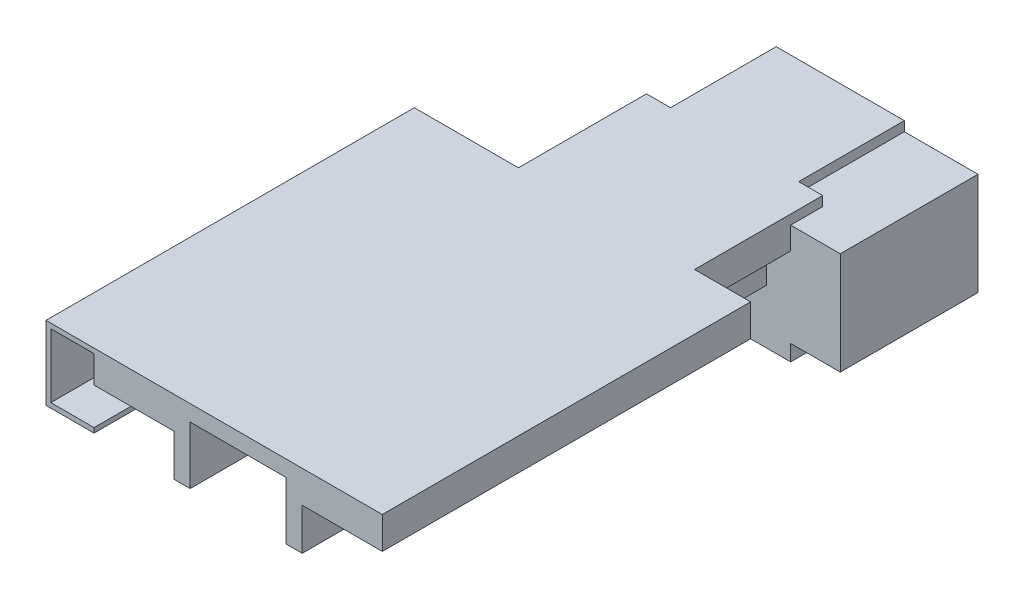
ISO-10303-21;
HEADER;
FILE_DESCRIPTION(('STEP AP214'),'2;1');
FILE_NAME('part.step','',(''),(''),'','','');
FILE_SCHEMA(('AUTOMOTIVE_DESIGN { 1 0 10303 214 1 1 1 1 }'));
ENDSEC;
DATA;
#1=APPLICATION_CONTEXT('core data for automotive mechanical design processes');
#2=APPLICATION_PROTOCOL_DEFINITION('international standard','automotive_design',2000,#1);
#3=PRODUCT_CONTEXT('',#1,'mechanical');
#4=PRODUCT('Part','Part','',(#3));
#5=PRODUCT_RELATED_PRODUCT_CATEGORY('part','',(#4));
#6=PRODUCT_DEFINITION_FORMATION('','',#4);
#7=PRODUCT_DEFINITION_CONTEXT('part definition',#1,'design');
#8=PRODUCT_DEFINITION('design','',#6,#7);
#9=PRODUCT_DEFINITION_SHAPE('','',#8);
#10=(LENGTH_UNIT() NAMED_UNIT(*) SI_UNIT(.MILLI.,.METRE.));
#11=(NAMED_UNIT(*) PLANE_ANGLE_UNIT() SI_UNIT($,.RADIAN.));
#12=(NAMED_UNIT(*) SI_UNIT($,.STERADIAN.) SOLID_ANGLE_UNIT());
#13=UNCERTAINTY_MEASURE_WITH_UNIT(LENGTH_MEASURE(1.E-05),#10,'distance_accuracy_value','');
#14=(GEOMETRIC_REPRESENTATION_CONTEXT(3) GLOBAL_UNCERTAINTY_ASSIGNED_CONTEXT((#13)) GLOBAL_UNIT_ASSIGNED_CONTEXT((#10,
#11,#12)) REPRESENTATION_CONTEXT('',''));
#15=CARTESIAN_POINT('',(0.,0.,0.));
#16=DIRECTION('',(0.,0.,1.));
#17=DIRECTION('',(1.,0.,0.));
#18=AXIS2_PLACEMENT_3D('',#15,#16,#17);
#19=CARTESIAN_POINT('',(0.,0.,-40.));
#20=DIRECTION('',(0.,0.,-1.));
#21=DIRECTION('',(-1.,0.,0.));
#22=AXIS2_PLACEMENT_3D('',#19,#20,#21);
#23=PLANE('',#22);
#24=DIRECTION('',(0.,-1.,0.));
#25=VECTOR('',#24,1.);
#26=CARTESIAN_POINT('',(72.5,-40.,-40.));
#27=LINE('',#26,#25);
#28=CARTESIAN_POINT('',(72.5,0.,-40.));
#29=VERTEX_POINT('',#28);
#30=CARTESIAN_POINT('',(72.5,-3.,-40.));
#31=VERTEX_POINT('',#30);
#32=EDGE_CURVE('E357',#29,#31,#27,.T.);
#33=ORIENTED_EDGE('',*,*,#32,.T.);
#34=DIRECTION('',(-1.,0.,0.));
#35=VECTOR('',#34,1.);
#36=CARTESIAN_POINT('',(72.5,-3.,-40.));
#37=LINE('',#36,#35);
#38=CARTESIAN_POINT('',(65.,-3.,-40.));
#39=VERTEX_POINT('',#38);
#40=EDGE_CURVE('E299',#31,#39,#37,.T.);
#41=ORIENTED_EDGE('',*,*,#40,.T.);
#42=DIRECTION('',(0.,-1.,0.));
#43=VECTOR('',#42,1.);
#44=CARTESIAN_POINT('',(65.,-40.,-40.));
#45=LINE('',#44,#43);
#46=CARTESIAN_POINT('',(65.,0.,-40.));
#47=VERTEX_POINT('',#46);
#48=EDGE_CURVE('E339',#47,#39,#45,.T.);
#49=ORIENTED_EDGE('',*,*,#48,.F.);
#50=DIRECTION('',(1.,0.,0.));
#51=VECTOR('',#50,1.);
#52=CARTESIAN_POINT('',(17.5,0.,-40.));
#53=LINE('',#52,#51);
#54=EDGE_CURVE('E368',#47,#29,#53,.T.);
#55=ORIENTED_EDGE('',*,*,#54,.T.);
#56=EDGE_LOOP('',(#33,#41,#49,#55));
#57=FACE_BOUND('',#56,.T.);
#58=ADVANCED_FACE('F33',(#57),#23,.T.);
#59=CARTESIAN_POINT('',(72.5,0.,-30.));
#60=DIRECTION('',(-1.,0.,0.));
#61=DIRECTION('',(0.,0.,1.));
#62=AXIS2_PLACEMENT_3D('',#59,#60,#61);
#63=PLANE('',#62);
#64=DIRECTION('',(0.,0.,1.));
#65=VECTOR('',#64,1.);
#66=CARTESIAN_POINT('',(72.5,-10.,-30.));
#67=LINE('',#66,#65);
#68=CARTESIAN_POINT('',(72.5,-10.,-30.));
#69=VERTEX_POINT('',#68);
#70=CARTESIAN_POINT('',(72.5,-10.,0.));
#71=VERTEX_POINT('',#70);
#72=EDGE_CURVE('E412',#69,#71,#67,.T.);
#73=ORIENTED_EDGE('',*,*,#72,.F.);
#74=DIRECTION('',(0.,-1.,0.));
#75=VECTOR('',#74,1.);
#76=CARTESIAN_POINT('',(72.5,-3.,-30.));
#77=LINE('',#76,#75);
#78=CARTESIAN_POINT('',(72.5,-3.,-30.));
#79=VERTEX_POINT('',#78);
#80=EDGE_CURVE('E325',#79,#69,#77,.T.);
#81=ORIENTED_EDGE('',*,*,#80,.F.);
#82=DIRECTION('',(0.,0.,-1.));
#83=VECTOR('',#82,1.);
#84=CARTESIAN_POINT('',(72.5,-3.,-40.));
#85=LINE('',#84,#83);
#86=EDGE_CURVE('E296',#79,#31,#85,.T.);
#87=ORIENTED_EDGE('',*,*,#86,.T.);
#88=ORIENTED_EDGE('',*,*,#32,.F.);
#89=DIRECTION('',(0.,0.,1.));
#90=VECTOR('',#89,1.);
#91=CARTESIAN_POINT('',(72.5,0.,-30.));
#92=LINE('',#91,#90);
#93=CARTESIAN_POINT('',(72.5,0.,0.));
#94=VERTEX_POINT('',#93);
#95=EDGE_CURVE('E418',#29,#94,#92,.T.);
#96=ORIENTED_EDGE('',*,*,#95,.T.);
#97=DIRECTION('',(0.,-1.,0.));
#98=VECTOR('',#97,1.);
#99=CARTESIAN_POINT('',(72.5,0.,0.));
#100=LINE('',#99,#98);
#101=EDGE_CURVE('E388',#94,#71,#100,.T.);
#102=ORIENTED_EDGE('',*,*,#101,.T.);
#103=EDGE_LOOP('',(#73,#81,#87,#88,#96,#102));
#104=FACE_BOUND('',#103,.T.);
#105=ADVANCED_FACE('F537',(#104),#63,.F.);
#106=CARTESIAN_POINT('',(65.,-40.,-73.));
#107=DIRECTION('',(-1.,0.,0.));
#108=DIRECTION('',(0.,0.,1.));
#109=AXIS2_PLACEMENT_3D('',#106,#107,#108);
#110=PLANE('',#109);
#111=DIRECTION('',(0.,0.,-1.));
#112=VECTOR('',#111,1.);
#113=CARTESIAN_POINT('',(65.,-3.,-73.));
#114=LINE('',#113,#112);
#115=CARTESIAN_POINT('',(65.,-3.,-73.));
#116=VERTEX_POINT('',#115);
#117=EDGE_CURVE('E302',#39,#116,#114,.T.);
#118=ORIENTED_EDGE('',*,*,#117,.T.);
#119=DIRECTION('',(0.,-1.,0.));
#120=VECTOR('',#119,1.);
#121=CARTESIAN_POINT('',(65.,-40.,-73.));
#122=LINE('',#121,#120);
#123=CARTESIAN_POINT('',(65.,0.,-73.));
#124=VERTEX_POINT('',#123);
#125=EDGE_CURVE('E328',#124,#116,#122,.T.);
#126=ORIENTED_EDGE('',*,*,#125,.F.);
#127=DIRECTION('',(0.,0.,1.));
#128=VECTOR('',#127,1.);
#129=CARTESIAN_POINT('',(65.,0.,-73.));
#130=LINE('',#129,#128);
#131=EDGE_CURVE('E338',#124,#47,#130,.T.);
#132=ORIENTED_EDGE('',*,*,#131,.T.);
#133=ORIENTED_EDGE('',*,*,#48,.T.);
#134=EDGE_LOOP('',(#118,#126,#132,#133));
#135=FACE_BOUND('',#134,.T.);
#136=ADVANCED_FACE('F585',(#135),#110,.F.);
#137=DIRECTION('',(-1.,0.,0.));
#138=VECTOR('',#137,1.);
#139=CARTESIAN_POINT('',(72.5,-35.,-40.));
#140=LINE('',#139,#138);
#141=CARTESIAN_POINT('',(72.5,-35.,-40.));
#142=VERTEX_POINT('',#141);
#143=CARTESIAN_POINT('',(65.,-35.,-40.));
#144=VERTEX_POINT('',#143);
#145=EDGE_CURVE('E317',#142,#144,#140,.T.);
#146=ORIENTED_EDGE('',*,*,#145,.F.);
#147=CARTESIAN_POINT('',(72.5,-40.,-40.));
#148=VERTEX_POINT('',#147);
#149=EDGE_CURVE('E361',#142,#148,#27,.T.);
#150=ORIENTED_EDGE('',*,*,#149,.T.);
#151=DIRECTION('',(-1.,0.,0.));
#152=VECTOR('',#151,1.);
#153=CARTESIAN_POINT('',(17.5,-40.,-40.));
#154=LINE('',#153,#152);
#155=CARTESIAN_POINT('',(65.,-40.,-40.));
#156=VERTEX_POINT('',#155);
#157=EDGE_CURVE('E362',#148,#156,#154,.T.);
#158=ORIENTED_EDGE('',*,*,#157,.T.);
#159=EDGE_CURVE('E324',#144,#156,#45,.T.);
#160=ORIENTED_EDGE('',*,*,#159,.F.);
#161=EDGE_LOOP('',(#146,#150,#158,#160));
#162=FACE_BOUND('',#161,.T.);
#163=ADVANCED_FACE('F521',(#162),#23,.T.);
#164=CARTESIAN_POINT('',(0.,0.,0.));
#165=DIRECTION('',(0.,0.,-1.));
#166=DIRECTION('',(-1.,0.,0.));
#167=AXIS2_PLACEMENT_3D('',#164,#165,#166);
#168=PLANE('',#167);
#169=ORIENTED_EDGE('',*,*,#101,.F.);
#170=DIRECTION('',(-1.,0.,0.));
#171=VECTOR('',#170,1.);
#172=CARTESIAN_POINT('',(0.,0.,0.));
#173=LINE('',#172,#171);
#174=CARTESIAN_POINT('',(90.,0.,0.));
#175=VERTEX_POINT('',#174);
#176=EDGE_CURVE('E267',#175,#94,#173,.T.);
#177=ORIENTED_EDGE('',*,*,#176,.F.);
#178=DIRECTION('',(0.,1.,0.));
#179=VECTOR('',#178,1.);
#180=CARTESIAN_POINT('',(90.,0.,0.));
#181=LINE('',#180,#179);
#182=CARTESIAN_POINT('',(90.,-10.,0.));
#183=VERTEX_POINT('',#182);
#184=EDGE_CURVE('E268',#183,#175,#181,.T.);
#185=ORIENTED_EDGE('',*,*,#184,.F.);
#186=DIRECTION('',(1.,0.,0.));
#187=VECTOR('',#186,1.);
#188=CARTESIAN_POINT('',(90.,-10.,0.));
#189=LINE('',#188,#187);
#190=EDGE_CURVE('E454',#71,#183,#189,.T.);
#191=ORIENTED_EDGE('',*,*,#190,.F.);
#192=EDGE_LOOP('',(#169,#177,#185,#191));
#193=FACE_BOUND('',#192,.T.);
#194=ADVANCED_FACE('F590',(#193),#168,.T.);
#195=CARTESIAN_POINT('',(0.,-10.,115.));
#196=DIRECTION('',(1.,0.,0.));
#197=DIRECTION('',(0.,0.,-1.));
#198=AXIS2_PLACEMENT_3D('',#195,#196,#197);
#199=PLANE('',#198);
#200=DIRECTION('',(0.,-1.,0.));
#201=VECTOR('',#200,1.);
#202=CARTESIAN_POINT('',(0.,-10.,115.));
#203=LINE('',#202,#201);
#204=CARTESIAN_POINT('',(0.,-1.5,115.));
#205=VERTEX_POINT('',#204);
#206=CARTESIAN_POINT('',(0.,-10.,115.));
#207=VERTEX_POINT('',#206);
#208=EDGE_CURVE('E48',#205,#207,#203,.T.);
#209=ORIENTED_EDGE('',*,*,#208,.F.);
#210=DIRECTION('',(0.,0.,1.));
#211=VECTOR('',#210,1.);
#212=CARTESIAN_POINT('',(0.,-1.5,-27.459060435492));
#213=LINE('',#212,#211);
#214=CARTESIAN_POINT('',(0.,-1.5,0.));
#215=VERTEX_POINT('',#214);
#216=EDGE_CURVE('E313',#215,#205,#213,.T.);
#217=ORIENTED_EDGE('',*,*,#216,.F.);
#218=DIRECTION('',(0.,-1.,0.));
#219=VECTOR('',#218,1.);
#220=CARTESIAN_POINT('',(0.,-10.,0.));
#221=LINE('',#220,#219);
#222=CARTESIAN_POINT('',(0.,-10.,0.));
#223=VERTEX_POINT('',#222);
#224=EDGE_CURVE('E425',#215,#223,#221,.T.);
#225=ORIENTED_EDGE('',*,*,#224,.T.);
#226=DIRECTION('',(0.,0.,-1.));
#227=VECTOR('',#226,1.);
#228=CARTESIAN_POINT('',(0.,-10.,115.));
#229=LINE('',#228,#227);
#230=EDGE_CURVE('E11',#207,#223,#229,.T.);
#231=ORIENTED_EDGE('',*,*,#230,.F.);
#232=EDGE_LOOP('',(#209,#217,#225,#231));
#233=FACE_BOUND('',#232,.T.);
#234=ADVANCED_FACE('F35',(#233),#199,.F.);
#235=CARTESIAN_POINT('',(25.,-9.99999999999999,115.));
#236=DIRECTION('',(0.,1.,0.));
#237=DIRECTION('',(-1.,0.,0.));
#238=AXIS2_PLACEMENT_3D('',#235,#236,#237);
#239=PLANE('',#238);
#240=DIRECTION('',(1.,0.,0.));
#241=VECTOR('',#240,1.);
#242=CARTESIAN_POINT('',(25.,-9.99999999999999,0.));
#243=LINE('',#242,#241);
#244=CARTESIAN_POINT('',(17.5,-9.99999999999999,0.));
#245=VERTEX_POINT('',#244);
#246=EDGE_CURVE('E451',#223,#245,#243,.T.);
#247=ORIENTED_EDGE('',*,*,#246,.T.);
#248=DIRECTION('',(0.,0.,1.));
#249=VECTOR('',#248,1.);
#250=CARTESIAN_POINT('',(17.5,-10.,-30.));
#251=LINE('',#250,#249);
#252=CARTESIAN_POINT('',(17.5,-9.99999999999999,-30.));
#253=VERTEX_POINT('',#252);
#254=EDGE_CURVE('E422',#253,#245,#251,.T.);
#255=ORIENTED_EDGE('',*,*,#254,.F.);
#256=DIRECTION('',(-1.,0.,0.));
#257=VECTOR('',#256,1.);
#258=CARTESIAN_POINT('',(25.,-9.99999999999999,-30.));
#259=LINE('',#258,#257);
#260=CARTESIAN_POINT('',(25.,-9.99999999999999,-30.));
#261=VERTEX_POINT('',#260);
#262=EDGE_CURVE('E409',#261,#253,#259,.T.);
#263=ORIENTED_EDGE('',*,*,#262,.F.);
#264=DIRECTION('',(0.,0.,-1.));
#265=VECTOR('',#264,1.);
#266=CARTESIAN_POINT('',(25.,-9.99999999999999,115.));
#267=LINE('',#266,#265);
#268=CARTESIAN_POINT('',(25.,-9.99999999999999,115.));
#269=VERTEX_POINT('',#268);
#270=EDGE_CURVE('E41',#269,#261,#267,.T.);
#271=ORIENTED_EDGE('',*,*,#270,.F.);
#272=DIRECTION('',(1.,0.,0.));
#273=VECTOR('',#272,1.);
#274=CARTESIAN_POINT('',(25.,-9.99999999999999,115.));
#275=LINE('',#274,#273);
#276=EDGE_CURVE('E427',#207,#269,#275,.T.);
#277=ORIENTED_EDGE('',*,*,#276,.F.);
#278=ORIENTED_EDGE('',*,*,#230,.T.);
#279=EDGE_LOOP('',(#247,#255,#263,#271,#277,#278));
#280=FACE_BOUND('',#279,.T.);
#281=ADVANCED_FACE('F484',(#280),#239,.F.);
#282=CARTESIAN_POINT('',(25.,-23.,115.));
#283=DIRECTION('',(1.,0.,0.));
#284=DIRECTION('',(0.,1.,0.));
#285=AXIS2_PLACEMENT_3D('',#282,#283,#284);
#286=PLANE('',#285);
#287=ORIENTED_EDGE('',*,*,#270,.T.);
#288=DIRECTION('',(0.,1.,0.));
#289=VECTOR('',#288,1.);
#290=CARTESIAN_POINT('',(25.,-23.,-30.));
#291=LINE('',#290,#289);
#292=CARTESIAN_POINT('',(25.,-23.,-30.));
#293=VERTEX_POINT('',#292);
#294=EDGE_CURVE('E406',#293,#261,#291,.T.);
#295=ORIENTED_EDGE('',*,*,#294,.F.);
#296=DIRECTION('',(0.,0.,-1.));
#297=VECTOR('',#296,1.);
#298=CARTESIAN_POINT('',(25.,-23.,115.));
#299=LINE('',#298,#297);
#300=CARTESIAN_POINT('',(25.,-23.,115.));
#301=VERTEX_POINT('',#300);
#302=EDGE_CURVE('E474',#301,#293,#299,.T.);
#303=ORIENTED_EDGE('',*,*,#302,.F.);
#304=DIRECTION('',(0.,-1.,0.));
#305=VECTOR('',#304,1.);
#306=CARTESIAN_POINT('',(25.,-23.,115.));
#307=LINE('',#306,#305);
#308=EDGE_CURVE('E429',#269,#301,#307,.T.);
#309=ORIENTED_EDGE('',*,*,#308,.F.);
#310=EDGE_LOOP('',(#287,#295,#303,#309));
#311=FACE_BOUND('',#310,.T.);
#312=ADVANCED_FACE('F480',(#311),#286,.F.);
#313=CARTESIAN_POINT('',(30.,-23.,115.));
#314=DIRECTION('',(0.,1.,0.));
#315=DIRECTION('',(-1.,0.,0.));
#316=AXIS2_PLACEMENT_3D('',#313,#314,#315);
#317=PLANE('',#316);
#318=ORIENTED_EDGE('',*,*,#302,.T.);
#319=DIRECTION('',(-1.,0.,0.));
#320=VECTOR('',#319,1.);
#321=CARTESIAN_POINT('',(30.,-23.,-30.));
#322=LINE('',#321,#320);
#323=CARTESIAN_POINT('',(30.,-23.,-30.));
#324=VERTEX_POINT('',#323);
#325=EDGE_CURVE('E403',#324,#293,#322,.T.);
#326=ORIENTED_EDGE('',*,*,#325,.F.);
#327=DIRECTION('',(0.,0.,-1.));
#328=VECTOR('',#327,1.);
#329=CARTESIAN_POINT('',(30.,-23.,115.));
#330=LINE('',#329,#328);
#331=CARTESIAN_POINT('',(30.,-23.,115.));
#332=VERTEX_POINT('',#331);
#333=EDGE_CURVE('E472',#332,#324,#330,.T.);
#334=ORIENTED_EDGE('',*,*,#333,.F.);
#335=DIRECTION('',(1.,0.,0.));
#336=VECTOR('',#335,1.);
#337=CARTESIAN_POINT('',(30.,-23.,115.));
#338=LINE('',#337,#336);
#339=EDGE_CURVE('E431',#301,#332,#338,.T.);
#340=ORIENTED_EDGE('',*,*,#339,.F.);
#341=EDGE_LOOP('',(#318,#326,#334,#340));
#342=FACE_BOUND('',#341,.T.);
#343=ADVANCED_FACE('F493',(#342),#317,.F.);
#344=CARTESIAN_POINT('',(30.,-5.,115.));
#345=DIRECTION('',(-1.,0.,0.));
#346=DIRECTION('',(0.,-1.,0.));
#347=AXIS2_PLACEMENT_3D('',#344,#345,#346);
#348=PLANE('',#347);
#349=ORIENTED_EDGE('',*,*,#333,.T.);
#350=DIRECTION('',(0.,-1.,0.));
#351=VECTOR('',#350,1.);
#352=CARTESIAN_POINT('',(30.,-5.,-30.));
#353=LINE('',#352,#351);
#354=CARTESIAN_POINT('',(30.,-5.,-30.));
#355=VERTEX_POINT('',#354);
#356=EDGE_CURVE('E400',#355,#324,#353,.T.);
#357=ORIENTED_EDGE('',*,*,#356,.F.);
#358=DIRECTION('',(0.,0.,-1.));
#359=VECTOR('',#358,1.);
#360=CARTESIAN_POINT('',(30.,-5.,115.));
#361=LINE('',#360,#359);
#362=CARTESIAN_POINT('',(30.,-5.,115.));
#363=VERTEX_POINT('',#362);
#364=EDGE_CURVE('E470',#363,#355,#361,.T.);
#365=ORIENTED_EDGE('',*,*,#364,.F.);
#366=DIRECTION('',(0.,1.,0.));
#367=VECTOR('',#366,1.);
#368=CARTESIAN_POINT('',(30.,-5.,115.));
#369=LINE('',#368,#367);
#370=EDGE_CURVE('E433',#332,#363,#369,.T.);
#371=ORIENTED_EDGE('',*,*,#370,.F.);
#372=EDGE_LOOP('',(#349,#357,#365,#371));
#373=FACE_BOUND('',#372,.T.);
#374=ADVANCED_FACE('F570',(#373),#348,.F.);
#375=CARTESIAN_POINT('',(60.,-5.,115.));
#376=DIRECTION('',(0.,1.,0.));
#377=DIRECTION('',(0.,0.,1.));
#378=AXIS2_PLACEMENT_3D('',#375,#376,#377);
#379=PLANE('',#378);
#380=ORIENTED_EDGE('',*,*,#364,.T.);
#381=DIRECTION('',(-1.,0.,0.));
#382=VECTOR('',#381,1.);
#383=CARTESIAN_POINT('',(60.,-5.,-30.));
#384=LINE('',#383,#382);
#385=CARTESIAN_POINT('',(60.,-5.,-30.));
#386=VERTEX_POINT('',#385);
#387=EDGE_CURVE('E397',#386,#355,#384,.T.);
#388=ORIENTED_EDGE('',*,*,#387,.F.);
#389=DIRECTION('',(0.,0.,-1.));
#390=VECTOR('',#389,1.);
#391=CARTESIAN_POINT('',(60.,-5.,115.));
#392=LINE('',#391,#390);
#393=CARTESIAN_POINT('',(60.,-5.,115.));
#394=VERTEX_POINT('',#393);
#395=EDGE_CURVE('E468',#394,#386,#392,.T.);
#396=ORIENTED_EDGE('',*,*,#395,.F.);
#397=DIRECTION('',(1.,0.,0.));
#398=VECTOR('',#397,1.);
#399=CARTESIAN_POINT('',(60.,-5.,115.));
#400=LINE('',#399,#398);
#401=EDGE_CURVE('E435',#363,#394,#400,.T.);
#402=ORIENTED_EDGE('',*,*,#401,.F.);
#403=EDGE_LOOP('',(#380,#388,#396,#402));
#404=FACE_BOUND('',#403,.T.);
#405=ADVANCED_FACE('F567',(#404),#379,.F.);
#406=CARTESIAN_POINT('',(60.,-23.,115.));
#407=DIRECTION('',(1.,0.,0.));
#408=DIRECTION('',(0.,1.,0.));
#409=AXIS2_PLACEMENT_3D('',#406,#407,#408);
#410=PLANE('',#409);
#411=ORIENTED_EDGE('',*,*,#395,.T.);
#412=DIRECTION('',(0.,1.,0.));
#413=VECTOR('',#412,1.);
#414=CARTESIAN_POINT('',(60.,-23.,-30.));
#415=LINE('',#414,#413);
#416=CARTESIAN_POINT('',(60.,-23.,-30.));
#417=VERTEX_POINT('',#416);
#418=EDGE_CURVE('E394',#417,#386,#415,.T.);
#419=ORIENTED_EDGE('',*,*,#418,.F.);
#420=DIRECTION('',(0.,0.,-1.));
#421=VECTOR('',#420,1.);
#422=CARTESIAN_POINT('',(60.,-23.,115.));
#423=LINE('',#422,#421);
#424=CARTESIAN_POINT('',(60.,-23.,115.));
#425=VERTEX_POINT('',#424);
#426=EDGE_CURVE('E466',#425,#417,#423,.T.);
#427=ORIENTED_EDGE('',*,*,#426,.F.);
#428=DIRECTION('',(0.,-1.,0.));
#429=VECTOR('',#428,1.);
#430=CARTESIAN_POINT('',(60.,-23.,115.));
#431=LINE('',#430,#429);
#432=EDGE_CURVE('E437',#394,#425,#431,.T.);
#433=ORIENTED_EDGE('',*,*,#432,.F.);
#434=EDGE_LOOP('',(#411,#419,#427,#433));
#435=FACE_BOUND('',#434,.T.);
#436=ADVANCED_FACE('F563',(#435),#410,.F.);
#437=CARTESIAN_POINT('',(65.,-23.,115.));
#438=DIRECTION('',(0.,1.,0.));
#439=DIRECTION('',(0.,0.,1.));
#440=AXIS2_PLACEMENT_3D('',#437,#438,#439);
#441=PLANE('',#440);
#442=ORIENTED_EDGE('',*,*,#426,.T.);
#443=DIRECTION('',(-1.,0.,0.));
#444=VECTOR('',#443,1.);
#445=CARTESIAN_POINT('',(65.,-23.,-30.));
#446=LINE('',#445,#444);
#447=CARTESIAN_POINT('',(65.,-23.,-30.));
#448=VERTEX_POINT('',#447);
#449=EDGE_CURVE('E391',#448,#417,#446,.T.);
#450=ORIENTED_EDGE('',*,*,#449,.F.);
#451=DIRECTION('',(0.,0.,-1.));
#452=VECTOR('',#451,1.);
#453=CARTESIAN_POINT('',(65.,-23.,115.));
#454=LINE('',#453,#452);
#455=CARTESIAN_POINT('',(65.,-23.,115.));
#456=VERTEX_POINT('',#455);
#457=EDGE_CURVE('E464',#456,#448,#454,.T.);
#458=ORIENTED_EDGE('',*,*,#457,.F.);
#459=DIRECTION('',(1.,0.,0.));
#460=VECTOR('',#459,1.);
#461=CARTESIAN_POINT('',(65.,-23.,115.));
#462=LINE('',#461,#460);
#463=EDGE_CURVE('E439',#425,#456,#462,.T.);
#464=ORIENTED_EDGE('',*,*,#463,.F.);
#465=EDGE_LOOP('',(#442,#450,#458,#464));
#466=FACE_BOUND('',#465,.T.);
#467=ADVANCED_FACE('F558',(#466),#441,.F.);
#468=CARTESIAN_POINT('',(65.,-10.,115.));
#469=DIRECTION('',(-1.,0.,0.));
#470=DIRECTION('',(0.,0.,1.));
#471=AXIS2_PLACEMENT_3D('',#468,#469,#470);
#472=PLANE('',#471);
#473=ORIENTED_EDGE('',*,*,#457,.T.);
#474=DIRECTION('',(0.,-1.,0.));
#475=VECTOR('',#474,1.);
#476=CARTESIAN_POINT('',(65.,-10.,-30.));
#477=LINE('',#476,#475);
#478=CARTESIAN_POINT('',(65.,-10.,-30.));
#479=VERTEX_POINT('',#478);
#480=EDGE_CURVE('E387',#479,#448,#477,.T.);
#481=ORIENTED_EDGE('',*,*,#480,.F.);
#482=DIRECTION('',(0.,0.,-1.));
#483=VECTOR('',#482,1.);
#484=CARTESIAN_POINT('',(65.,-10.,115.));
#485=LINE('',#484,#483);
#486=CARTESIAN_POINT('',(65.,-10.,115.));
#487=VERTEX_POINT('',#486);
#488=EDGE_CURVE('E462',#487,#479,#485,.T.);
#489=ORIENTED_EDGE('',*,*,#488,.F.);
#490=DIRECTION('',(0.,1.,0.));
#491=VECTOR('',#490,1.);
#492=CARTESIAN_POINT('',(65.,-10.,115.));
#493=LINE('',#492,#491);
#494=EDGE_CURVE('E441',#456,#487,#493,.T.);
#495=ORIENTED_EDGE('',*,*,#494,.F.);
#496=EDGE_LOOP('',(#473,#481,#489,#495));
#497=FACE_BOUND('',#496,.T.);
#498=ADVANCED_FACE('F553',(#497),#472,.F.);
#499=CARTESIAN_POINT('',(90.,-10.,115.));
#500=DIRECTION('',(0.,1.,0.));
#501=DIRECTION('',(0.,0.,1.));
#502=AXIS2_PLACEMENT_3D('',#499,#500,#501);
#503=PLANE('',#502);
#504=ORIENTED_EDGE('',*,*,#488,.T.);
#505=DIRECTION('',(-1.,0.,0.));
#506=VECTOR('',#505,1.);
#507=CARTESIAN_POINT('',(72.5,-10.,-30.));
#508=LINE('',#507,#506);
#509=EDGE_CURVE('E384',#69,#479,#508,.T.);
#510=ORIENTED_EDGE('',*,*,#509,.F.);
#511=ORIENTED_EDGE('',*,*,#72,.T.);
#512=ORIENTED_EDGE('',*,*,#190,.T.);
#513=DIRECTION('',(0.,0.,-1.));
#514=VECTOR('',#513,1.);
#515=CARTESIAN_POINT('',(90.,-10.,115.));
#516=LINE('',#515,#514);
#517=CARTESIAN_POINT('',(90.,-10.,115.));
#518=VERTEX_POINT('',#517);
#519=EDGE_CURVE('E459',#518,#183,#516,.T.);
#520=ORIENTED_EDGE('',*,*,#519,.F.);
#521=DIRECTION('',(1.,0.,0.));
#522=VECTOR('',#521,1.);
#523=CARTESIAN_POINT('',(90.,-10.,115.));
#524=LINE('',#523,#522);
#525=EDGE_CURVE('E443',#487,#518,#524,.T.);
#526=ORIENTED_EDGE('',*,*,#525,.F.);
#527=EDGE_LOOP('',(#504,#510,#511,#512,#520,#526));
#528=FACE_BOUND('',#527,.T.);
#529=ADVANCED_FACE('F546',(#528),#503,.F.);
#530=CARTESIAN_POINT('',(90.,0.,115.));
#531=DIRECTION('',(-1.,0.,0.));
#532=DIRECTION('',(0.,-1.,0.));
#533=AXIS2_PLACEMENT_3D('',#530,#531,#532);
#534=PLANE('',#533);
#535=ORIENTED_EDGE('',*,*,#184,.T.);
#536=DIRECTION('',(0.,0.,-1.));
#537=VECTOR('',#536,1.);
#538=CARTESIAN_POINT('',(90.,0.,115.));
#539=LINE('',#538,#537);
#540=CARTESIAN_POINT('',(90.,0.,115.));
#541=VERTEX_POINT('',#540);
#542=EDGE_CURVE('E449',#541,#175,#539,.T.);
#543=ORIENTED_EDGE('',*,*,#542,.F.);
#544=DIRECTION('',(0.,1.,0.));
#545=VECTOR('',#544,1.);
#546=CARTESIAN_POINT('',(90.,0.,115.));
#547=LINE('',#546,#545);
#548=EDGE_CURVE('E445',#518,#541,#547,.T.);
#549=ORIENTED_EDGE('',*,*,#548,.F.);
#550=ORIENTED_EDGE('',*,*,#519,.T.);
#551=EDGE_LOOP('',(#535,#543,#549,#550));
#552=FACE_BOUND('',#551,.T.);
#553=ADVANCED_FACE('F691',(#552),#534,.F.);
#554=CARTESIAN_POINT('',(0.,0.,115.));
#555=DIRECTION('',(0.,-1.,0.));
#556=DIRECTION('',(0.,0.,-1.));
#557=AXIS2_PLACEMENT_3D('',#554,#555,#556);
#558=PLANE('',#557);
#559=ORIENTED_EDGE('',*,*,#176,.T.);
#560=ORIENTED_EDGE('',*,*,#95,.F.);
#561=ORIENTED_EDGE('',*,*,#54,.F.);
#562=ORIENTED_EDGE('',*,*,#131,.F.);
#563=DIRECTION('',(1.,0.,0.));
#564=VECTOR('',#563,1.);
#565=CARTESIAN_POINT('',(25.,0.,-73.));
#566=LINE('',#565,#564);
#567=CARTESIAN_POINT('',(25.,0.,-73.));
#568=VERTEX_POINT('',#567);
#569=EDGE_CURVE('E336',#568,#124,#566,.T.);
#570=ORIENTED_EDGE('',*,*,#569,.F.);
#571=DIRECTION('',(0.,0.,1.));
#572=VECTOR('',#571,1.);
#573=CARTESIAN_POINT('',(25.,0.,-73.));
#574=LINE('',#573,#572);
#575=CARTESIAN_POINT('',(25.,0.,-40.));
#576=VERTEX_POINT('',#575);
#577=EDGE_CURVE('E347',#568,#576,#574,.T.);
#578=ORIENTED_EDGE('',*,*,#577,.T.);
#579=CARTESIAN_POINT('',(17.5,0.,-40.));
#580=VERTEX_POINT('',#579);
#581=EDGE_CURVE('E369',#580,#576,#53,.T.);
#582=ORIENTED_EDGE('',*,*,#581,.F.);
#583=DIRECTION('',(0.,0.,1.));
#584=VECTOR('',#583,1.);
#585=CARTESIAN_POINT('',(17.5,0.,-30.));
#586=LINE('',#585,#584);
#587=CARTESIAN_POINT('',(17.5,0.,0.));
#588=VERTEX_POINT('',#587);
#589=EDGE_CURVE('E264',#580,#588,#586,.T.);
#590=ORIENTED_EDGE('',*,*,#589,.T.);
#591=CARTESIAN_POINT('',(-15.,0.,0.));
#592=VERTEX_POINT('',#591);
#593=EDGE_CURVE('E255',#588,#592,#173,.T.);
#594=ORIENTED_EDGE('',*,*,#593,.T.);
#595=DIRECTION('',(0.,0.,1.));
#596=VECTOR('',#595,1.);
#597=CARTESIAN_POINT('',(-15.,0.,-27.459060435492));
#598=LINE('',#597,#596);
#599=CARTESIAN_POINT('',(-15.,0.,115.));
#600=VERTEX_POINT('',#599);
#601=EDGE_CURVE('E261',#592,#600,#598,.T.);
#602=ORIENTED_EDGE('',*,*,#601,.T.);
#603=DIRECTION('',(-1.,0.,0.));
#604=VECTOR('',#603,1.);
#605=CARTESIAN_POINT('',(0.,0.,115.));
#606=LINE('',#605,#604);
#607=EDGE_CURVE('E447',#541,#600,#606,.T.);
#608=ORIENTED_EDGE('',*,*,#607,.F.);
#609=ORIENTED_EDGE('',*,*,#542,.T.);
#610=EDGE_LOOP('',(#559,#560,#561,#562,#570,#578,#582,#590,#594,#602,#608,#609));
#611=FACE_BOUND('',#610,.T.);
#612=ADVANCED_FACE('F258',(#611),#558,.F.);
#613=CARTESIAN_POINT('',(0.,0.,115.));
#614=DIRECTION('',(0.,0.,-1.));
#615=DIRECTION('',(-1.,0.,0.));
#616=AXIS2_PLACEMENT_3D('',#613,#614,#615);
#617=PLANE('',#616);
#618=ORIENTED_EDGE('',*,*,#607,.T.);
#619=DIRECTION('',(0.,-1.,0.));
#620=VECTOR('',#619,1.);
#621=CARTESIAN_POINT('',(-15.,0.,115.));
#622=LINE('',#621,#620);
#623=CARTESIAN_POINT('',(-15.,-23.,115.));
#624=VERTEX_POINT('',#623);
#625=EDGE_CURVE('E281',#600,#624,#622,.T.);
#626=ORIENTED_EDGE('',*,*,#625,.T.);
#627=DIRECTION('',(1.,0.,0.));
#628=VECTOR('',#627,1.);
#629=CARTESIAN_POINT('',(-15.,-23.,115.));
#630=LINE('',#629,#628);
#631=CARTESIAN_POINT('',(0.,-23.,115.));
#632=VERTEX_POINT('',#631);
#633=EDGE_CURVE('E676',#624,#632,#630,.T.);
#634=ORIENTED_EDGE('',*,*,#633,.T.);
#635=DIRECTION('',(0.,1.,0.));
#636=VECTOR('',#635,1.);
#637=CARTESIAN_POINT('',(0.,-23.,115.));
#638=LINE('',#637,#636);
#639=CARTESIAN_POINT('',(0.,-21.5,115.));
#640=VERTEX_POINT('',#639);
#641=EDGE_CURVE('E678',#632,#640,#638,.T.);
#642=ORIENTED_EDGE('',*,*,#641,.T.);
#643=DIRECTION('',(-1.,0.,0.));
#644=VECTOR('',#643,1.);
#645=CARTESIAN_POINT('',(0.,-21.5,115.));
#646=LINE('',#645,#644);
#647=CARTESIAN_POINT('',(-13.5,-21.5,115.));
#648=VERTEX_POINT('',#647);
#649=EDGE_CURVE('E682',#640,#648,#646,.T.);
#650=ORIENTED_EDGE('',*,*,#649,.T.);
#651=DIRECTION('',(0.,1.,0.));
#652=VECTOR('',#651,1.);
#653=CARTESIAN_POINT('',(-13.5,-21.5,115.));
#654=LINE('',#653,#652);
#655=CARTESIAN_POINT('',(-13.5,-1.5,115.));
#656=VERTEX_POINT('',#655);
#657=EDGE_CURVE('E285',#648,#656,#654,.T.);
#658=ORIENTED_EDGE('',*,*,#657,.T.);
#659=DIRECTION('',(1.,0.,0.));
#660=VECTOR('',#659,1.);
#661=CARTESIAN_POINT('',(-13.5,-1.5,115.));
#662=LINE('',#661,#660);
#663=EDGE_CURVE('E282',#656,#205,#662,.T.);
#664=ORIENTED_EDGE('',*,*,#663,.T.);
#665=ORIENTED_EDGE('',*,*,#208,.T.);
#666=ORIENTED_EDGE('',*,*,#276,.T.);
#667=ORIENTED_EDGE('',*,*,#308,.T.);
#668=ORIENTED_EDGE('',*,*,#339,.T.);
#669=ORIENTED_EDGE('',*,*,#370,.T.);
#670=ORIENTED_EDGE('',*,*,#401,.T.);
#671=ORIENTED_EDGE('',*,*,#432,.T.);
#672=ORIENTED_EDGE('',*,*,#463,.T.);
#673=ORIENTED_EDGE('',*,*,#494,.T.);
#674=ORIENTED_EDGE('',*,*,#525,.T.);
#675=ORIENTED_EDGE('',*,*,#548,.T.);
#676=EDGE_LOOP('',(#618,#626,#634,#642,#650,#658,#664,#665,#666,#667,#668,#669,#670,#671,#672,
#673,#674,#675));
#677=FACE_BOUND('',#676,.T.);
#678=ADVANCED_FACE('F497',(#677),#617,.F.);
#679=DIRECTION('',(0.,1.,0.));
#680=VECTOR('',#679,1.);
#681=CARTESIAN_POINT('',(17.5,-10.,0.));
#682=LINE('',#681,#680);
#683=EDGE_CURVE('E383',#245,#588,#682,.T.);
#684=ORIENTED_EDGE('',*,*,#683,.F.);
#685=ORIENTED_EDGE('',*,*,#246,.F.);
#686=ORIENTED_EDGE('',*,*,#224,.F.);
#687=DIRECTION('',(1.,0.,0.));
#688=VECTOR('',#687,1.);
#689=CARTESIAN_POINT('',(-13.5,-1.5,0.));
#690=LINE('',#689,#688);
#691=CARTESIAN_POINT('',(-13.5,-1.5,0.));
#692=VERTEX_POINT('',#691);
#693=EDGE_CURVE('E650',#692,#215,#690,.T.);
#694=ORIENTED_EDGE('',*,*,#693,.F.);
#695=DIRECTION('',(0.,1.,0.));
#696=VECTOR('',#695,1.);
#697=CARTESIAN_POINT('',(-13.5,-21.5,0.));
#698=LINE('',#697,#696);
#699=CARTESIAN_POINT('',(-13.5,-21.5,0.));
#700=VERTEX_POINT('',#699);
#701=EDGE_CURVE('E653',#700,#692,#698,.T.);
#702=ORIENTED_EDGE('',*,*,#701,.F.);
#703=DIRECTION('',(-1.,0.,0.));
#704=VECTOR('',#703,1.);
#705=CARTESIAN_POINT('',(0.,-21.5,0.));
#706=LINE('',#705,#704);
#707=CARTESIAN_POINT('',(0.,-21.5,0.));
#708=VERTEX_POINT('',#707);
#709=EDGE_CURVE('E659',#708,#700,#706,.T.);
#710=ORIENTED_EDGE('',*,*,#709,.F.);
#711=DIRECTION('',(0.,1.,0.));
#712=VECTOR('',#711,1.);
#713=CARTESIAN_POINT('',(0.,-23.,0.));
#714=LINE('',#713,#712);
#715=CARTESIAN_POINT('',(0.,-23.,0.));
#716=VERTEX_POINT('',#715);
#717=EDGE_CURVE('E666',#716,#708,#714,.T.);
#718=ORIENTED_EDGE('',*,*,#717,.F.);
#719=DIRECTION('',(1.,0.,0.));
#720=VECTOR('',#719,1.);
#721=CARTESIAN_POINT('',(-15.,-23.,0.));
#722=LINE('',#721,#720);
#723=CARTESIAN_POINT('',(-15.,-23.,0.));
#724=VERTEX_POINT('',#723);
#725=EDGE_CURVE('E274',#724,#716,#722,.T.);
#726=ORIENTED_EDGE('',*,*,#725,.F.);
#727=DIRECTION('',(0.,-1.,0.));
#728=VECTOR('',#727,1.);
#729=CARTESIAN_POINT('',(-15.,0.,0.));
#730=LINE('',#729,#728);
#731=EDGE_CURVE('E271',#592,#724,#730,.T.);
#732=ORIENTED_EDGE('',*,*,#731,.F.);
#733=ORIENTED_EDGE('',*,*,#593,.F.);
#734=EDGE_LOOP('',(#684,#685,#686,#694,#702,#710,#718,#726,#732,#733));
#735=FACE_BOUND('',#734,.T.);
#736=ADVANCED_FACE('F272',(#735),#168,.T.);
#737=CARTESIAN_POINT('',(17.5,-10.,-30.));
#738=DIRECTION('',(1.,0.,0.));
#739=DIRECTION('',(0.,1.,0.));
#740=AXIS2_PLACEMENT_3D('',#737,#738,#739);
#741=PLANE('',#740);
#742=ORIENTED_EDGE('',*,*,#683,.T.);
#743=ORIENTED_EDGE('',*,*,#589,.F.);
#744=DIRECTION('',(0.,1.,0.));
#745=VECTOR('',#744,1.);
#746=CARTESIAN_POINT('',(17.5,-40.,-40.));
#747=LINE('',#746,#745);
#748=CARTESIAN_POINT('',(17.5,-40.,-40.));
#749=VERTEX_POINT('',#748);
#750=EDGE_CURVE('E365',#749,#580,#747,.T.);
#751=ORIENTED_EDGE('',*,*,#750,.F.);
#752=DIRECTION('',(0.,0.,1.));
#753=VECTOR('',#752,1.);
#754=CARTESIAN_POINT('',(17.5,-40.,-40.));
#755=LINE('',#754,#753);
#756=CARTESIAN_POINT('',(17.5,-40.,-30.));
#757=VERTEX_POINT('',#756);
#758=EDGE_CURVE('E371',#749,#757,#755,.T.);
#759=ORIENTED_EDGE('',*,*,#758,.T.);
#760=DIRECTION('',(0.,1.,0.));
#761=VECTOR('',#760,1.);
#762=CARTESIAN_POINT('',(17.5,-40.,-30.));
#763=LINE('',#762,#761);
#764=EDGE_CURVE('E375',#757,#253,#763,.T.);
#765=ORIENTED_EDGE('',*,*,#764,.T.);
#766=ORIENTED_EDGE('',*,*,#254,.T.);
#767=EDGE_LOOP('',(#742,#743,#751,#759,#765,#766));
#768=FACE_BOUND('',#767,.T.);
#769=ADVANCED_FACE('F502',(#768),#741,.F.);
#770=ORIENTED_EDGE('',*,*,#149,.F.);
#771=DIRECTION('',(0.,0.,-1.));
#772=VECTOR('',#771,1.);
#773=CARTESIAN_POINT('',(72.5,-35.,-40.));
#774=LINE('',#773,#772);
#775=CARTESIAN_POINT('',(72.5,-35.,-30.));
#776=VERTEX_POINT('',#775);
#777=EDGE_CURVE('E315',#776,#142,#774,.T.);
#778=ORIENTED_EDGE('',*,*,#777,.F.);
#779=DIRECTION('',(0.,-1.,0.));
#780=VECTOR('',#779,1.);
#781=CARTESIAN_POINT('',(72.5,-40.,-30.));
#782=LINE('',#781,#780);
#783=CARTESIAN_POINT('',(72.5,-40.,-30.));
#784=VERTEX_POINT('',#783);
#785=EDGE_CURVE('E356',#776,#784,#782,.T.);
#786=ORIENTED_EDGE('',*,*,#785,.T.);
#787=DIRECTION('',(0.,0.,1.));
#788=VECTOR('',#787,1.);
#789=CARTESIAN_POINT('',(72.5,-40.,-40.));
#790=LINE('',#789,#788);
#791=EDGE_CURVE('E380',#148,#784,#790,.T.);
#792=ORIENTED_EDGE('',*,*,#791,.F.);
#793=EDGE_LOOP('',(#770,#778,#786,#792));
#794=FACE_BOUND('',#793,.T.);
#795=ADVANCED_FACE('F513',(#794),#63,.F.);
#796=CARTESIAN_POINT('',(0.,0.,-30.));
#797=DIRECTION('',(0.,0.,-1.));
#798=DIRECTION('',(-1.,0.,0.));
#799=AXIS2_PLACEMENT_3D('',#796,#797,#798);
#800=PLANE('',#799);
#801=ORIENTED_EDGE('',*,*,#785,.F.);
#802=DIRECTION('',(-1.,0.,0.));
#803=VECTOR('',#802,1.);
#804=CARTESIAN_POINT('',(88.,-35.,-30.));
#805=LINE('',#804,#803);
#806=CARTESIAN_POINT('',(88.,-35.,-30.));
#807=VERTEX_POINT('',#806);
#808=EDGE_CURVE('E312',#807,#776,#805,.T.);
#809=ORIENTED_EDGE('',*,*,#808,.F.);
#810=DIRECTION('',(0.,-1.,0.));
#811=VECTOR('',#810,1.);
#812=CARTESIAN_POINT('',(88.,-3.00000000000001,-30.));
#813=LINE('',#812,#811);
#814=CARTESIAN_POINT('',(88.,-3.00000000000001,-30.));
#815=VERTEX_POINT('',#814);
#816=EDGE_CURVE('E308',#815,#807,#813,.T.);
#817=ORIENTED_EDGE('',*,*,#816,.F.);
#818=DIRECTION('',(-1.,0.,0.));
#819=VECTOR('',#818,1.);
#820=CARTESIAN_POINT('',(88.,-3.00000000000001,-30.));
#821=LINE('',#820,#819);
#822=EDGE_CURVE('E293',#815,#79,#821,.T.);
#823=ORIENTED_EDGE('',*,*,#822,.T.);
#824=ORIENTED_EDGE('',*,*,#80,.T.);
#825=ORIENTED_EDGE('',*,*,#509,.T.);
#826=ORIENTED_EDGE('',*,*,#480,.T.);
#827=ORIENTED_EDGE('',*,*,#449,.T.);
#828=ORIENTED_EDGE('',*,*,#418,.T.);
#829=ORIENTED_EDGE('',*,*,#387,.T.);
#830=ORIENTED_EDGE('',*,*,#356,.T.);
#831=ORIENTED_EDGE('',*,*,#325,.T.);
#832=ORIENTED_EDGE('',*,*,#294,.T.);
#833=ORIENTED_EDGE('',*,*,#262,.T.);
#834=ORIENTED_EDGE('',*,*,#764,.F.);
#835=DIRECTION('',(-1.,0.,0.));
#836=VECTOR('',#835,1.);
#837=CARTESIAN_POINT('',(17.5,-40.,-30.));
#838=LINE('',#837,#836);
#839=EDGE_CURVE('E373',#784,#757,#838,.T.);
#840=ORIENTED_EDGE('',*,*,#839,.F.);
#841=EDGE_LOOP('',(#801,#809,#817,#823,#824,#825,#826,#827,#828,#829,#830,#831,#832,#833,#834,#840));
#842=FACE_BOUND('',#841,.T.);
#843=ADVANCED_FACE('F488',(#842),#800,.F.);
#844=CARTESIAN_POINT('',(17.5,-40.,-40.));
#845=DIRECTION('',(0.,1.,0.));
#846=DIRECTION('',(-1.,0.,0.));
#847=AXIS2_PLACEMENT_3D('',#844,#845,#846);
#848=PLANE('',#847);
#849=ORIENTED_EDGE('',*,*,#839,.T.);
#850=ORIENTED_EDGE('',*,*,#758,.F.);
#851=CARTESIAN_POINT('',(25.,-40.,-40.));
#852=VERTEX_POINT('',#851);
#853=EDGE_CURVE('E360',#852,#749,#154,.T.);
#854=ORIENTED_EDGE('',*,*,#853,.F.);
#855=DIRECTION('',(0.,0.,1.));
#856=VECTOR('',#855,1.);
#857=CARTESIAN_POINT('',(25.,-40.,-73.));
#858=LINE('',#857,#856);
#859=CARTESIAN_POINT('',(25.,-40.,-73.));
#860=VERTEX_POINT('',#859);
#861=EDGE_CURVE('E350',#860,#852,#858,.T.);
#862=ORIENTED_EDGE('',*,*,#861,.F.);
#863=DIRECTION('',(-1.,0.,0.));
#864=VECTOR('',#863,1.);
#865=CARTESIAN_POINT('',(25.,-40.,-73.));
#866=LINE('',#865,#864);
#867=CARTESIAN_POINT('',(65.,-40.,-73.));
#868=VERTEX_POINT('',#867);
#869=EDGE_CURVE('E331',#868,#860,#866,.T.);
#870=ORIENTED_EDGE('',*,*,#869,.F.);
#871=DIRECTION('',(0.,0.,1.));
#872=VECTOR('',#871,1.);
#873=CARTESIAN_POINT('',(65.,-40.,-73.));
#874=LINE('',#873,#872);
#875=EDGE_CURVE('E353',#868,#156,#874,.T.);
#876=ORIENTED_EDGE('',*,*,#875,.T.);
#877=ORIENTED_EDGE('',*,*,#157,.F.);
#878=ORIENTED_EDGE('',*,*,#791,.T.);
#879=EDGE_LOOP('',(#849,#850,#854,#862,#870,#876,#877,#878));
#880=FACE_BOUND('',#879,.T.);
#881=ADVANCED_FACE('F510',(#880),#848,.F.);
#882=DIRECTION('',(0.,1.,0.));
#883=VECTOR('',#882,1.);
#884=CARTESIAN_POINT('',(25.,-40.,-40.));
#885=LINE('',#884,#883);
#886=EDGE_CURVE('E342',#852,#576,#885,.T.);
#887=ORIENTED_EDGE('',*,*,#886,.F.);
#888=ORIENTED_EDGE('',*,*,#853,.T.);
#889=ORIENTED_EDGE('',*,*,#750,.T.);
#890=ORIENTED_EDGE('',*,*,#581,.T.);
#891=EDGE_LOOP('',(#887,#888,#889,#890));
#892=FACE_BOUND('',#891,.T.);
#893=ADVANCED_FACE('F581',(#892),#23,.T.);
#894=CARTESIAN_POINT('',(65.,-35.,-73.));
#895=VERTEX_POINT('',#894);
#896=EDGE_CURVE('E332',#895,#868,#122,.T.);
#897=ORIENTED_EDGE('',*,*,#896,.F.);
#898=DIRECTION('',(0.,0.,-1.));
#899=VECTOR('',#898,1.);
#900=CARTESIAN_POINT('',(65.,-35.,-73.));
#901=LINE('',#900,#899);
#902=EDGE_CURVE('E319',#144,#895,#901,.T.);
#903=ORIENTED_EDGE('',*,*,#902,.F.);
#904=ORIENTED_EDGE('',*,*,#159,.T.);
#905=ORIENTED_EDGE('',*,*,#875,.F.);
#906=EDGE_LOOP('',(#897,#903,#904,#905));
#907=FACE_BOUND('',#906,.T.);
#908=ADVANCED_FACE('F525',(#907),#110,.F.);
#909=CARTESIAN_POINT('',(25.,-40.,-73.));
#910=DIRECTION('',(1.,0.,0.));
#911=DIRECTION('',(0.,0.,-1.));
#912=AXIS2_PLACEMENT_3D('',#909,#910,#911);
#913=PLANE('',#912);
#914=ORIENTED_EDGE('',*,*,#886,.T.);
#915=ORIENTED_EDGE('',*,*,#577,.F.);
#916=DIRECTION('',(0.,1.,0.));
#917=VECTOR('',#916,1.);
#918=CARTESIAN_POINT('',(25.,-40.,-73.));
#919=LINE('',#918,#917);
#920=EDGE_CURVE('E334',#860,#568,#919,.T.);
#921=ORIENTED_EDGE('',*,*,#920,.F.);
#922=ORIENTED_EDGE('',*,*,#861,.T.);
#923=EDGE_LOOP('',(#914,#915,#921,#922));
#924=FACE_BOUND('',#923,.T.);
#925=ADVANCED_FACE('F597',(#924),#913,.F.);
#926=CARTESIAN_POINT('',(0.,0.,-73.));
#927=DIRECTION('',(0.,0.,-1.));
#928=DIRECTION('',(-1.,0.,0.));
#929=AXIS2_PLACEMENT_3D('',#926,#927,#928);
#930=PLANE('',#929);
#931=ORIENTED_EDGE('',*,*,#125,.T.);
#932=DIRECTION('',(1.,0.,0.));
#933=VECTOR('',#932,1.);
#934=CARTESIAN_POINT('',(65.,-3.,-73.));
#935=LINE('',#934,#933);
#936=CARTESIAN_POINT('',(88.,-3.00000000000001,-73.));
#937=VERTEX_POINT('',#936);
#938=EDGE_CURVE('E305',#116,#937,#935,.T.);
#939=ORIENTED_EDGE('',*,*,#938,.T.);
#940=DIRECTION('',(0.,-1.,0.));
#941=VECTOR('',#940,1.);
#942=CARTESIAN_POINT('',(88.,-3.00000000000001,-73.));
#943=LINE('',#942,#941);
#944=CARTESIAN_POINT('',(88.,-35.,-73.));
#945=VERTEX_POINT('',#944);
#946=EDGE_CURVE('E322',#937,#945,#943,.T.);
#947=ORIENTED_EDGE('',*,*,#946,.T.);
#948=DIRECTION('',(1.,0.,0.));
#949=VECTOR('',#948,1.);
#950=CARTESIAN_POINT('',(65.,-35.,-73.));
#951=LINE('',#950,#949);
#952=EDGE_CURVE('E56',#895,#945,#951,.T.);
#953=ORIENTED_EDGE('',*,*,#952,.F.);
#954=ORIENTED_EDGE('',*,*,#896,.T.);
#955=ORIENTED_EDGE('',*,*,#869,.T.);
#956=ORIENTED_EDGE('',*,*,#920,.T.);
#957=ORIENTED_EDGE('',*,*,#569,.T.);
#958=EDGE_LOOP('',(#931,#939,#947,#953,#954,#955,#956,#957));
#959=FACE_BOUND('',#958,.T.);
#960=ADVANCED_FACE('F606',(#959),#930,.T.);
#961=CARTESIAN_POINT('',(88.,-3.00000000000001,-73.));
#962=DIRECTION('',(1.,0.,0.));
#963=DIRECTION('',(0.,1.,0.));
#964=AXIS2_PLACEMENT_3D('',#961,#962,#963);
#965=PLANE('',#964);
#966=DIRECTION('',(0.,0.,1.));
#967=VECTOR('',#966,1.);
#968=CARTESIAN_POINT('',(88.,-35.,-73.));
#969=LINE('',#968,#967);
#970=EDGE_CURVE('E309',#945,#807,#969,.T.);
#971=ORIENTED_EDGE('',*,*,#970,.F.);
#972=ORIENTED_EDGE('',*,*,#946,.F.);
#973=DIRECTION('',(0.,0.,1.));
#974=VECTOR('',#973,1.);
#975=CARTESIAN_POINT('',(88.,-3.00000000000001,-73.));
#976=LINE('',#975,#974);
#977=EDGE_CURVE('E290',#937,#815,#976,.T.);
#978=ORIENTED_EDGE('',*,*,#977,.T.);
#979=ORIENTED_EDGE('',*,*,#816,.T.);
#980=EDGE_LOOP('',(#971,#972,#978,#979));
#981=FACE_BOUND('',#980,.T.);
#982=ADVANCED_FACE('F528',(#981),#965,.T.);
#983=CARTESIAN_POINT('',(0.,-2.99999999999997,0.));
#984=DIRECTION('',(0.,-1.,0.));
#985=DIRECTION('',(1.,0.,0.));
#986=AXIS2_PLACEMENT_3D('',#983,#984,#985);
#987=PLANE('',#986);
#988=ORIENTED_EDGE('',*,*,#977,.F.);
#989=ORIENTED_EDGE('',*,*,#938,.F.);
#990=ORIENTED_EDGE('',*,*,#117,.F.);
#991=ORIENTED_EDGE('',*,*,#40,.F.);
#992=ORIENTED_EDGE('',*,*,#86,.F.);
#993=ORIENTED_EDGE('',*,*,#822,.F.);
#994=EDGE_LOOP('',(#988,#989,#990,#991,#992,#993));
#995=FACE_BOUND('',#994,.T.);
#996=ADVANCED_FACE('F533',(#995),#987,.F.);
#997=CARTESIAN_POINT('',(0.,-35.,0.));
#998=DIRECTION('',(0.,-1.,0.));
#999=DIRECTION('',(1.,0.,0.));
#1000=AXIS2_PLACEMENT_3D('',#997,#998,#999);
#1001=PLANE('',#1000);
#1002=ORIENTED_EDGE('',*,*,#970,.T.);
#1003=ORIENTED_EDGE('',*,*,#808,.T.);
#1004=ORIENTED_EDGE('',*,*,#777,.T.);
#1005=ORIENTED_EDGE('',*,*,#145,.T.);
#1006=ORIENTED_EDGE('',*,*,#902,.T.);
#1007=ORIENTED_EDGE('',*,*,#952,.T.);
#1008=EDGE_LOOP('',(#1002,#1003,#1004,#1005,#1006,#1007));
#1009=FACE_BOUND('',#1008,.T.);
#1010=ADVANCED_FACE('F517',(#1009),#1001,.T.);
#1011=CARTESIAN_POINT('',(-15.,0.,-27.459060435492));
#1012=DIRECTION('',(-1.,0.,0.));
#1013=DIRECTION('',(0.,-1.,0.));
#1014=AXIS2_PLACEMENT_3D('',#1011,#1012,#1013);
#1015=PLANE('',#1014);
#1016=ORIENTED_EDGE('',*,*,#601,.F.);
#1017=ORIENTED_EDGE('',*,*,#731,.T.);
#1018=DIRECTION('',(0.,0.,1.));
#1019=VECTOR('',#1018,1.);
#1020=CARTESIAN_POINT('',(-15.,-23.,-27.459060435492));
#1021=LINE('',#1020,#1019);
#1022=EDGE_CURVE('E277',#724,#624,#1021,.T.);
#1023=ORIENTED_EDGE('',*,*,#1022,.T.);
#1024=ORIENTED_EDGE('',*,*,#625,.F.);
#1025=EDGE_LOOP('',(#1016,#1017,#1023,#1024));
#1026=FACE_BOUND('',#1025,.T.);
#1027=ADVANCED_FACE('F279',(#1026),#1015,.T.);
#1028=CARTESIAN_POINT('',(-15.,-23.,-27.459060435492));
#1029=DIRECTION('',(0.,-1.,0.));
#1030=DIRECTION('',(0.,0.,-1.));
#1031=AXIS2_PLACEMENT_3D('',#1028,#1029,#1030);
#1032=PLANE('',#1031);
#1033=ORIENTED_EDGE('',*,*,#1022,.F.);
#1034=ORIENTED_EDGE('',*,*,#725,.T.);
#1035=DIRECTION('',(0.,0.,1.));
#1036=VECTOR('',#1035,1.);
#1037=CARTESIAN_POINT('',(0.,-23.,-27.459060435492));
#1038=LINE('',#1037,#1036);
#1039=EDGE_CURVE('E669',#716,#632,#1038,.T.);
#1040=ORIENTED_EDGE('',*,*,#1039,.T.);
#1041=ORIENTED_EDGE('',*,*,#633,.F.);
#1042=EDGE_LOOP('',(#1033,#1034,#1040,#1041));
#1043=FACE_BOUND('',#1042,.T.);
#1044=ADVANCED_FACE('F625',(#1043),#1032,.T.);
#1045=CARTESIAN_POINT('',(0.,-23.,-27.459060435492));
#1046=DIRECTION('',(1.,0.,0.));
#1047=DIRECTION('',(0.,0.,-1.));
#1048=AXIS2_PLACEMENT_3D('',#1045,#1046,#1047);
#1049=PLANE('',#1048);
#1050=ORIENTED_EDGE('',*,*,#1039,.F.);
#1051=ORIENTED_EDGE('',*,*,#717,.T.);
#1052=DIRECTION('',(0.,0.,1.));
#1053=VECTOR('',#1052,1.);
#1054=CARTESIAN_POINT('',(0.,-21.5,-27.459060435492));
#1055=LINE('',#1054,#1053);
#1056=EDGE_CURVE('E665',#708,#640,#1055,.T.);
#1057=ORIENTED_EDGE('',*,*,#1056,.T.);
#1058=ORIENTED_EDGE('',*,*,#641,.F.);
#1059=EDGE_LOOP('',(#1050,#1051,#1057,#1058));
#1060=FACE_BOUND('',#1059,.T.);
#1061=ADVANCED_FACE('F628',(#1060),#1049,.T.);
#1062=CARTESIAN_POINT('',(0.,-21.5,-27.459060435492));
#1063=DIRECTION('',(0.,1.,0.));
#1064=DIRECTION('',(0.,0.,1.));
#1065=AXIS2_PLACEMENT_3D('',#1062,#1063,#1064);
#1066=PLANE('',#1065);
#1067=ORIENTED_EDGE('',*,*,#1056,.F.);
#1068=ORIENTED_EDGE('',*,*,#709,.T.);
#1069=DIRECTION('',(0.,0.,1.));
#1070=VECTOR('',#1069,1.);
#1071=CARTESIAN_POINT('',(-13.5,-21.5,-27.459060435492));
#1072=LINE('',#1071,#1070);
#1073=EDGE_CURVE('E656',#700,#648,#1072,.T.);
#1074=ORIENTED_EDGE('',*,*,#1073,.T.);
#1075=ORIENTED_EDGE('',*,*,#649,.F.);
#1076=EDGE_LOOP('',(#1067,#1068,#1074,#1075));
#1077=FACE_BOUND('',#1076,.T.);
#1078=ADVANCED_FACE('F632',(#1077),#1066,.T.);
#1079=CARTESIAN_POINT('',(-13.5,-21.5,-27.459060435492));
#1080=DIRECTION('',(1.,0.,0.));
#1081=DIRECTION('',(0.,1.,0.));
#1082=AXIS2_PLACEMENT_3D('',#1079,#1080,#1081);
#1083=PLANE('',#1082);
#1084=ORIENTED_EDGE('',*,*,#1073,.F.);
#1085=ORIENTED_EDGE('',*,*,#701,.T.);
#1086=DIRECTION('',(0.,0.,1.));
#1087=VECTOR('',#1086,1.);
#1088=CARTESIAN_POINT('',(-13.5,-1.5,-27.459060435492));
#1089=LINE('',#1088,#1087);
#1090=EDGE_CURVE('E648',#692,#656,#1089,.T.);
#1091=ORIENTED_EDGE('',*,*,#1090,.T.);
#1092=ORIENTED_EDGE('',*,*,#657,.F.);
#1093=EDGE_LOOP('',(#1084,#1085,#1091,#1092));
#1094=FACE_BOUND('',#1093,.T.);
#1095=ADVANCED_FACE('F636',(#1094),#1083,.T.);
#1096=CARTESIAN_POINT('',(-13.5,-1.5,-27.459060435492));
#1097=DIRECTION('',(0.,-1.,0.));
#1098=DIRECTION('',(1.,0.,0.));
#1099=AXIS2_PLACEMENT_3D('',#1096,#1097,#1098);
#1100=PLANE('',#1099);
#1101=ORIENTED_EDGE('',*,*,#1090,.F.);
#1102=ORIENTED_EDGE('',*,*,#693,.T.);
#1103=ORIENTED_EDGE('',*,*,#216,.T.);
#1104=ORIENTED_EDGE('',*,*,#663,.F.);
#1105=EDGE_LOOP('',(#1101,#1102,#1103,#1104));
#1106=FACE_BOUND('',#1105,.T.);
#1107=ADVANCED_FACE('F640',(#1106),#1100,.T.);
#1108=CLOSED_SHELL('',(#58,#105,#136,#163,#194,#234,#281,#312,#343,#374,#405,#436,#467,#498,
#529,#553,#612,#678,#736,#769,#795,#843,#881,#893,#908,#925,#960,#982,#996,#1010,#1027,#1044,
#1061,#1078,#1095,#1107));
#1109=MANIFOLD_SOLID_BREP('B2',#1108);
#1110=ADVANCED_BREP_SHAPE_REPRESENTATION('',(#18,#1109),#14);
#1111=SHAPE_DEFINITION_REPRESENTATION(#9,#1110);
ENDSEC;
END-ISO-10303-21;
